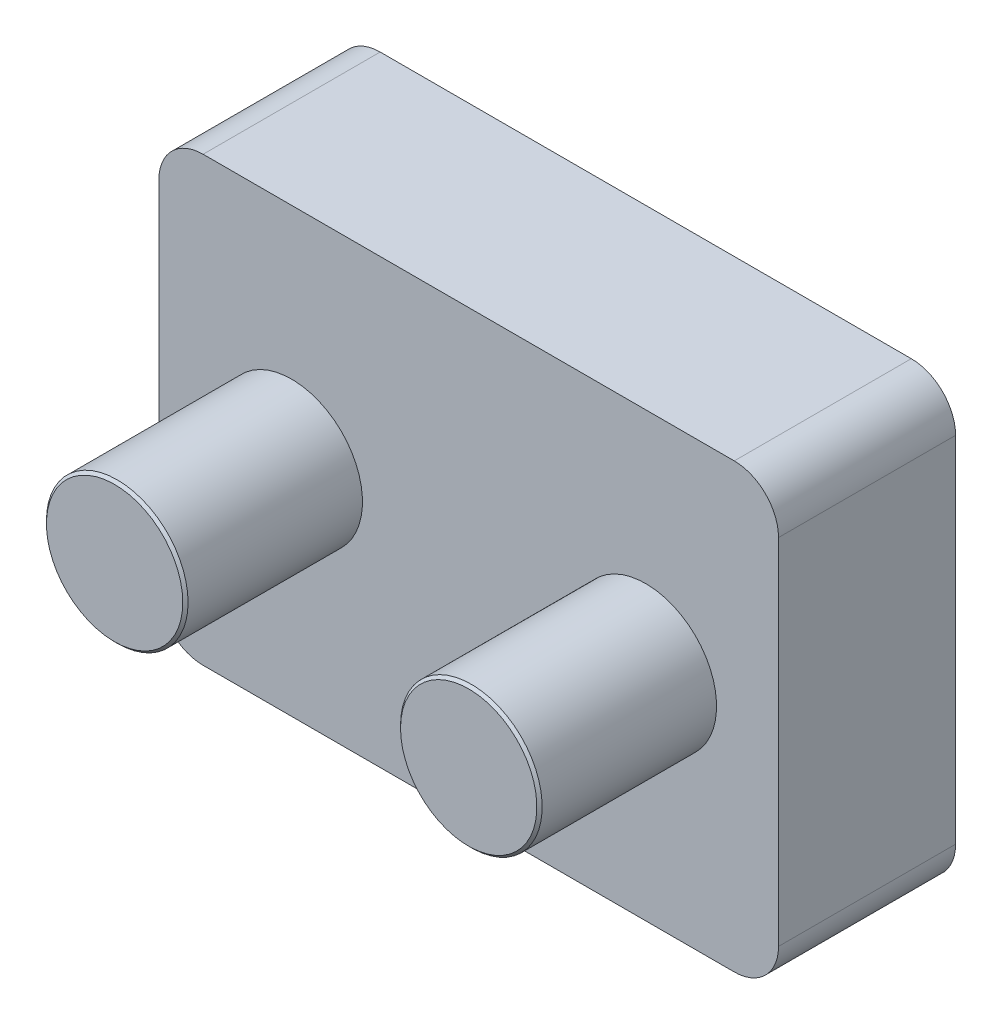
ISO-10303-21;
HEADER;
FILE_DESCRIPTION(('STEP AP214'),'2;1');
FILE_NAME('part.step','',(''),(''),'','','');
FILE_SCHEMA(('AUTOMOTIVE_DESIGN { 1 0 10303 214 1 1 1 1 }'));
ENDSEC;
DATA;
#1=APPLICATION_CONTEXT('core data for automotive mechanical design processes');
#2=APPLICATION_PROTOCOL_DEFINITION('international standard','automotive_design',2000,#1);
#3=PRODUCT_CONTEXT('',#1,'mechanical');
#4=PRODUCT('Part','Part','',(#3));
#5=PRODUCT_RELATED_PRODUCT_CATEGORY('part','',(#4));
#6=PRODUCT_DEFINITION_FORMATION('','',#4);
#7=PRODUCT_DEFINITION_CONTEXT('part definition',#1,'design');
#8=PRODUCT_DEFINITION('design','',#6,#7);
#9=PRODUCT_DEFINITION_SHAPE('','',#8);
#10=(LENGTH_UNIT() NAMED_UNIT(*) SI_UNIT(.MILLI.,.METRE.));
#11=(NAMED_UNIT(*) PLANE_ANGLE_UNIT() SI_UNIT($,.RADIAN.));
#12=(NAMED_UNIT(*) SI_UNIT($,.STERADIAN.) SOLID_ANGLE_UNIT());
#13=UNCERTAINTY_MEASURE_WITH_UNIT(LENGTH_MEASURE(1.E-05),#10,'distance_accuracy_value','');
#14=(GEOMETRIC_REPRESENTATION_CONTEXT(3) GLOBAL_UNCERTAINTY_ASSIGNED_CONTEXT((#13)) GLOBAL_UNIT_ASSIGNED_CONTEXT((#10,
#11,#12)) REPRESENTATION_CONTEXT('',''));
#15=CARTESIAN_POINT('',(0.,0.,0.));
#16=DIRECTION('',(0.,0.,1.));
#17=DIRECTION('',(1.,0.,0.));
#18=AXIS2_PLACEMENT_3D('',#15,#16,#17);
#19=CARTESIAN_POINT('',(-34.9999999999999,25.,20.0000000000001));
#20=DIRECTION('',(1.,0.,0.));
#21=DIRECTION('',(0.,1.,0.));
#22=AXIS2_PLACEMENT_3D('',#19,#20,#21);
#23=PLANE('',#22);
#24=DIRECTION('',(0.,-1.,0.));
#25=VECTOR('',#24,1.);
#26=CARTESIAN_POINT('',(-35.,25.,2.22044604925031E-13));
#27=LINE('',#26,#25);
#28=CARTESIAN_POINT('',(-35.,20.,2.22044604925031E-13));
#29=VERTEX_POINT('',#28);
#30=CARTESIAN_POINT('',(-35.,-20.,2.22044604925031E-13));
#31=VERTEX_POINT('',#30);
#32=EDGE_CURVE('E140',#29,#31,#27,.T.);
#33=ORIENTED_EDGE('',*,*,#32,.T.);
#34=DIRECTION('',(0.,0.,-1.));
#35=VECTOR('',#34,1.);
#36=CARTESIAN_POINT('',(-34.9999999999999,-20.,20.0000000000001));
#37=LINE('',#36,#35);
#38=CARTESIAN_POINT('',(-34.9999999999999,-20.,20.0000000000001));
#39=VERTEX_POINT('',#38);
#40=EDGE_CURVE('E118',#31,#39,#37,.F.);
#41=ORIENTED_EDGE('',*,*,#40,.T.);
#42=DIRECTION('',(0.,-1.,0.));
#43=VECTOR('',#42,1.);
#44=CARTESIAN_POINT('',(-34.9999999999999,25.,20.0000000000001));
#45=LINE('',#44,#43);
#46=CARTESIAN_POINT('',(-34.9999999999999,20.,20.0000000000001));
#47=VERTEX_POINT('',#46);
#48=EDGE_CURVE('E149',#47,#39,#45,.T.);
#49=ORIENTED_EDGE('',*,*,#48,.F.);
#50=DIRECTION('',(0.,0.,-1.));
#51=VECTOR('',#50,1.);
#52=CARTESIAN_POINT('',(-34.9999999999999,20.,20.0000000000001));
#53=LINE('',#52,#51);
#54=EDGE_CURVE('E123',#47,#29,#53,.T.);
#55=ORIENTED_EDGE('',*,*,#54,.T.);
#56=EDGE_LOOP('',(#33,#41,#49,#55));
#57=FACE_BOUND('',#56,.T.);
#58=ADVANCED_FACE('F47',(#57),#23,.F.);
#59=CARTESIAN_POINT('',(35.0000000000001,-25.,20.0000000000002));
#60=DIRECTION('',(0.,1.,0.));
#61=DIRECTION('',(-1.,0.,0.));
#62=AXIS2_PLACEMENT_3D('',#59,#60,#61);
#63=PLANE('',#62);
#64=DIRECTION('',(1.,0.,0.));
#65=VECTOR('',#64,1.);
#66=CARTESIAN_POINT('',(35.0000000000001,-25.,20.0000000000002));
#67=LINE('',#66,#65);
#68=CARTESIAN_POINT('',(-29.9999999999999,-25.,20.0000000000001));
#69=VERTEX_POINT('',#68);
#70=CARTESIAN_POINT('',(30.0000000000001,-25.,20.0000000000002));
#71=VERTEX_POINT('',#70);
#72=EDGE_CURVE('E133',#69,#71,#67,.T.);
#73=ORIENTED_EDGE('',*,*,#72,.F.);
#74=DIRECTION('',(0.,0.,-1.));
#75=VECTOR('',#74,1.);
#76=CARTESIAN_POINT('',(-29.9999999999999,-25.,20.0000000000001));
#77=LINE('',#76,#75);
#78=CARTESIAN_POINT('',(-30.,-25.,0.));
#79=VERTEX_POINT('',#78);
#80=EDGE_CURVE('E117',#69,#79,#77,.T.);
#81=ORIENTED_EDGE('',*,*,#80,.T.);
#82=DIRECTION('',(1.,0.,0.));
#83=VECTOR('',#82,1.);
#84=CARTESIAN_POINT('',(35.,-25.,0.));
#85=LINE('',#84,#83);
#86=CARTESIAN_POINT('',(30.,-25.,0.));
#87=VERTEX_POINT('',#86);
#88=EDGE_CURVE('E130',#79,#87,#85,.T.);
#89=ORIENTED_EDGE('',*,*,#88,.T.);
#90=DIRECTION('',(0.,0.,-1.));
#91=VECTOR('',#90,1.);
#92=CARTESIAN_POINT('',(30.0000000000001,-25.,20.0000000000002));
#93=LINE('',#92,#91);
#94=EDGE_CURVE('E135',#87,#71,#93,.F.);
#95=ORIENTED_EDGE('',*,*,#94,.T.);
#96=EDGE_LOOP('',(#73,#81,#89,#95));
#97=FACE_BOUND('',#96,.T.);
#98=ADVANCED_FACE('F129',(#97),#63,.F.);
#99=CARTESIAN_POINT('',(35.0000000000001,25.,20.0000000000002));
#100=DIRECTION('',(-1.,0.,0.));
#101=DIRECTION('',(0.,-1.,0.));
#102=AXIS2_PLACEMENT_3D('',#99,#100,#101);
#103=PLANE('',#102);
#104=DIRECTION('',(0.,1.,0.));
#105=VECTOR('',#104,1.);
#106=CARTESIAN_POINT('',(35.0000000000001,25.,20.0000000000002));
#107=LINE('',#106,#105);
#108=CARTESIAN_POINT('',(35.0000000000001,-20.,20.0000000000002));
#109=VERTEX_POINT('',#108);
#110=CARTESIAN_POINT('',(35.0000000000001,20.,20.0000000000002));
#111=VERTEX_POINT('',#110);
#112=EDGE_CURVE('E193',#109,#111,#107,.T.);
#113=ORIENTED_EDGE('',*,*,#112,.F.);
#114=DIRECTION('',(0.,0.,-1.));
#115=VECTOR('',#114,1.);
#116=CARTESIAN_POINT('',(35.0000000000001,-20.,20.0000000000002));
#117=LINE('',#116,#115);
#118=CARTESIAN_POINT('',(35.,-20.,0.));
#119=VERTEX_POINT('',#118);
#120=EDGE_CURVE('E186',#109,#119,#117,.T.);
#121=ORIENTED_EDGE('',*,*,#120,.T.);
#122=DIRECTION('',(0.,1.,0.));
#123=VECTOR('',#122,1.);
#124=CARTESIAN_POINT('',(35.,25.,0.));
#125=LINE('',#124,#123);
#126=CARTESIAN_POINT('',(35.,20.,0.));
#127=VERTEX_POINT('',#126);
#128=EDGE_CURVE('E139',#119,#127,#125,.T.);
#129=ORIENTED_EDGE('',*,*,#128,.T.);
#130=DIRECTION('',(0.,0.,-1.));
#131=VECTOR('',#130,1.);
#132=CARTESIAN_POINT('',(35.0000000000001,20.,20.0000000000002));
#133=LINE('',#132,#131);
#134=EDGE_CURVE('E184',#127,#111,#133,.F.);
#135=ORIENTED_EDGE('',*,*,#134,.T.);
#136=EDGE_LOOP('',(#113,#121,#129,#135));
#137=FACE_BOUND('',#136,.T.);
#138=ADVANCED_FACE('F191',(#137),#103,.F.);
#139=CARTESIAN_POINT('',(35.0000000000001,25.,20.0000000000002));
#140=DIRECTION('',(0.,-1.,0.));
#141=DIRECTION('',(1.,0.,0.));
#142=AXIS2_PLACEMENT_3D('',#139,#140,#141);
#143=PLANE('',#142);
#144=DIRECTION('',(-1.,0.,0.));
#145=VECTOR('',#144,1.);
#146=CARTESIAN_POINT('',(35.0000000000001,25.,20.0000000000002));
#147=LINE('',#146,#145);
#148=CARTESIAN_POINT('',(30.0000000000001,25.,20.0000000000002));
#149=VERTEX_POINT('',#148);
#150=CARTESIAN_POINT('',(-29.9999999999999,25.,20.0000000000001));
#151=VERTEX_POINT('',#150);
#152=EDGE_CURVE('E154',#149,#151,#147,.T.);
#153=ORIENTED_EDGE('',*,*,#152,.F.);
#154=DIRECTION('',(0.,0.,-1.));
#155=VECTOR('',#154,1.);
#156=CARTESIAN_POINT('',(30.0000000000001,25.,20.0000000000002));
#157=LINE('',#156,#155);
#158=CARTESIAN_POINT('',(30.,25.,0.));
#159=VERTEX_POINT('',#158);
#160=EDGE_CURVE('E13',#149,#159,#157,.T.);
#161=ORIENTED_EDGE('',*,*,#160,.T.);
#162=DIRECTION('',(-1.,0.,0.));
#163=VECTOR('',#162,1.);
#164=CARTESIAN_POINT('',(35.,25.,0.));
#165=LINE('',#164,#163);
#166=CARTESIAN_POINT('',(-30.,25.,0.));
#167=VERTEX_POINT('',#166);
#168=EDGE_CURVE('E143',#159,#167,#165,.T.);
#169=ORIENTED_EDGE('',*,*,#168,.T.);
#170=DIRECTION('',(0.,0.,-1.));
#171=VECTOR('',#170,1.);
#172=CARTESIAN_POINT('',(-29.9999999999999,25.,20.0000000000001));
#173=LINE('',#172,#171);
#174=EDGE_CURVE('E55',#167,#151,#173,.F.);
#175=ORIENTED_EDGE('',*,*,#174,.T.);
#176=EDGE_LOOP('',(#153,#161,#169,#175));
#177=FACE_BOUND('',#176,.T.);
#178=ADVANCED_FACE('F200',(#177),#143,.F.);
#179=CARTESIAN_POINT('',(1.11022302462516E-13,0.,20.0000000000002));
#180=DIRECTION('',(0.,0.,-1.));
#181=DIRECTION('',(-1.,0.,0.));
#182=AXIS2_PLACEMENT_3D('',#179,#180,#181);
#183=PLANE('',#182);
#184=CARTESIAN_POINT('',(20.0000000000001,0.,20.0000000000002));
#185=DIRECTION('',(0.,0.,-1.));
#186=DIRECTION('',(-1.,0.,0.));
#187=AXIS2_PLACEMENT_3D('',#184,#185,#186);
#188=CIRCLE('',#187,7.99999999999999);
#189=CARTESIAN_POINT('',(12.0000000000001,0.,20.0000000000002));
#190=VERTEX_POINT('',#189);
#191=EDGE_CURVE('E153',#190,#190,#188,.F.);
#192=ORIENTED_EDGE('',*,*,#191,.F.);
#193=EDGE_LOOP('',(#192));
#194=FACE_BOUND('',#193,.T.);
#195=CARTESIAN_POINT('',(-19.9999999999999,0.,20.0000000000001));
#196=DIRECTION('',(0.,0.,-1.));
#197=DIRECTION('',(-1.,0.,0.));
#198=AXIS2_PLACEMENT_3D('',#195,#196,#197);
#199=CIRCLE('',#198,8.);
#200=CARTESIAN_POINT('',(-27.9999999999999,0.,20.0000000000001));
#201=VERTEX_POINT('',#200);
#202=EDGE_CURVE('E150',#201,#201,#199,.F.);
#203=ORIENTED_EDGE('',*,*,#202,.F.);
#204=EDGE_LOOP('',(#203));
#205=FACE_BOUND('',#204,.T.);
#206=ORIENTED_EDGE('',*,*,#48,.T.);
#207=CARTESIAN_POINT('',(-29.9999999999999,-20.,20.0000000000001));
#208=DIRECTION('',(0.,0.,-1.));
#209=DIRECTION('',(-1.,0.,0.));
#210=AXIS2_PLACEMENT_3D('',#207,#208,#209);
#211=CIRCLE('',#210,5.);
#212=EDGE_CURVE('E182',#39,#69,#211,.F.);
#213=ORIENTED_EDGE('',*,*,#212,.T.);
#214=ORIENTED_EDGE('',*,*,#72,.T.);
#215=CARTESIAN_POINT('',(30.0000000000001,-20.,20.0000000000002));
#216=DIRECTION('',(0.,0.,-1.));
#217=DIRECTION('',(-1.,0.,0.));
#218=AXIS2_PLACEMENT_3D('',#215,#216,#217);
#219=CIRCLE('',#218,5.);
#220=EDGE_CURVE('E180',#71,#109,#219,.F.);
#221=ORIENTED_EDGE('',*,*,#220,.T.);
#222=ORIENTED_EDGE('',*,*,#112,.T.);
#223=CARTESIAN_POINT('',(30.0000000000001,20.,20.0000000000002));
#224=DIRECTION('',(0.,0.,-1.));
#225=DIRECTION('',(-1.,0.,0.));
#226=AXIS2_PLACEMENT_3D('',#223,#224,#225);
#227=CIRCLE('',#226,5.);
#228=EDGE_CURVE('E68',#111,#149,#227,.F.);
#229=ORIENTED_EDGE('',*,*,#228,.T.);
#230=ORIENTED_EDGE('',*,*,#152,.T.);
#231=CARTESIAN_POINT('',(-29.9999999999999,20.,20.0000000000001));
#232=DIRECTION('',(0.,0.,-1.));
#233=DIRECTION('',(-1.,0.,0.));
#234=AXIS2_PLACEMENT_3D('',#231,#232,#233);
#235=CIRCLE('',#234,5.);
#236=EDGE_CURVE('E177',#151,#47,#235,.F.);
#237=ORIENTED_EDGE('',*,*,#236,.T.);
#238=EDGE_LOOP('',(#206,#213,#214,#221,#222,#229,#230,#237));
#239=FACE_BOUND('',#238,.T.);
#240=ADVANCED_FACE('F207',(#194,#205,#239),#183,.F.);
#241=CARTESIAN_POINT('',(0.,0.,0.));
#242=DIRECTION('',(0.,0.,-1.));
#243=DIRECTION('',(-1.,0.,0.));
#244=AXIS2_PLACEMENT_3D('',#241,#242,#243);
#245=PLANE('',#244);
#246=ORIENTED_EDGE('',*,*,#88,.F.);
#247=CARTESIAN_POINT('',(-30.,-20.,0.));
#248=DIRECTION('',(0.,0.,-1.));
#249=DIRECTION('',(-1.,0.,0.));
#250=AXIS2_PLACEMENT_3D('',#247,#248,#249);
#251=CIRCLE('',#250,5.);
#252=EDGE_CURVE('E113',#79,#31,#251,.T.);
#253=ORIENTED_EDGE('',*,*,#252,.T.);
#254=ORIENTED_EDGE('',*,*,#32,.F.);
#255=CARTESIAN_POINT('',(-30.,20.,0.));
#256=DIRECTION('',(0.,0.,-1.));
#257=DIRECTION('',(-1.,0.,0.));
#258=AXIS2_PLACEMENT_3D('',#255,#256,#257);
#259=CIRCLE('',#258,5.);
#260=EDGE_CURVE('E134',#29,#167,#259,.T.);
#261=ORIENTED_EDGE('',*,*,#260,.T.);
#262=ORIENTED_EDGE('',*,*,#168,.F.);
#263=CARTESIAN_POINT('',(30.,20.,0.));
#264=DIRECTION('',(0.,0.,-1.));
#265=DIRECTION('',(-1.,0.,0.));
#266=AXIS2_PLACEMENT_3D('',#263,#264,#265);
#267=CIRCLE('',#266,5.);
#268=EDGE_CURVE('E171',#159,#127,#267,.T.);
#269=ORIENTED_EDGE('',*,*,#268,.T.);
#270=ORIENTED_EDGE('',*,*,#128,.F.);
#271=CARTESIAN_POINT('',(30.,-20.,0.));
#272=DIRECTION('',(0.,0.,-1.));
#273=DIRECTION('',(-1.,0.,0.));
#274=AXIS2_PLACEMENT_3D('',#271,#272,#273);
#275=CIRCLE('',#274,5.);
#276=EDGE_CURVE('E124',#119,#87,#275,.T.);
#277=ORIENTED_EDGE('',*,*,#276,.T.);
#278=EDGE_LOOP('',(#246,#253,#254,#261,#262,#269,#270,#277));
#279=FACE_BOUND('',#278,.T.);
#280=ADVANCED_FACE('F137',(#279),#245,.T.);
#281=CARTESIAN_POINT('',(-19.9999999999999,0.,40.0000000000001));
#282=DIRECTION('',(0.,0.,-1.));
#283=DIRECTION('',(-1.,0.,0.));
#284=AXIS2_PLACEMENT_3D('',#281,#282,#283);
#285=CYLINDRICAL_SURFACE('',#284,8.);
#286=CARTESIAN_POINT('',(-19.9999999999999,0.,39.7000000000001));
#287=DIRECTION('',(0.,0.,1.));
#288=DIRECTION('',(1.,0.,0.));
#289=AXIS2_PLACEMENT_3D('',#286,#287,#288);
#290=CIRCLE('',#289,8.);
#291=CARTESIAN_POINT('',(-11.9999999999999,0.,39.7000000000001));
#292=VERTEX_POINT('',#291);
#293=EDGE_CURVE('E166',#292,#292,#290,.F.);
#294=ORIENTED_EDGE('',*,*,#293,.T.);
#295=EDGE_LOOP('',(#294));
#296=FACE_BOUND('',#295,.T.);
#297=ORIENTED_EDGE('',*,*,#202,.T.);
#298=EDGE_LOOP('',(#297));
#299=FACE_BOUND('',#298,.T.);
#300=ADVANCED_FACE('F278',(#296,#299),#285,.T.);
#301=CARTESIAN_POINT('',(-19.9999999999999,0.,40.0000000000001));
#302=DIRECTION('',(0.,0.,1.));
#303=DIRECTION('',(1.,0.,0.));
#304=AXIS2_PLACEMENT_3D('',#301,#302,#303);
#305=PLANE('',#304);
#306=CARTESIAN_POINT('',(-19.9999999999999,0.,40.0000000000001));
#307=DIRECTION('',(0.,0.,1.));
#308=DIRECTION('',(1.,0.,0.));
#309=AXIS2_PLACEMENT_3D('',#306,#307,#308);
#310=CIRCLE('',#309,7.70000000000001);
#311=CARTESIAN_POINT('',(-12.2999999999999,0.,40.0000000000001));
#312=VERTEX_POINT('',#311);
#313=EDGE_CURVE('E163',#312,#312,#310,.T.);
#314=ORIENTED_EDGE('',*,*,#313,.T.);
#315=EDGE_LOOP('',(#314));
#316=FACE_BOUND('',#315,.T.);
#317=ADVANCED_FACE('F270',(#316),#305,.T.);
#318=CARTESIAN_POINT('',(20.0000000000001,0.,40.0000000000002));
#319=DIRECTION('',(0.,0.,-1.));
#320=DIRECTION('',(-1.,0.,0.));
#321=AXIS2_PLACEMENT_3D('',#318,#319,#320);
#322=CYLINDRICAL_SURFACE('',#321,7.99999999999999);
#323=CARTESIAN_POINT('',(20.0000000000001,0.,39.7000000000002));
#324=DIRECTION('',(0.,0.,-1.));
#325=DIRECTION('',(-1.,0.,0.));
#326=AXIS2_PLACEMENT_3D('',#323,#324,#325);
#327=CIRCLE('',#326,7.99999999999999);
#328=CARTESIAN_POINT('',(12.0000000000001,0.,39.7000000000002));
#329=VERTEX_POINT('',#328);
#330=EDGE_CURVE('E160',#329,#329,#327,.T.);
#331=ORIENTED_EDGE('',*,*,#330,.T.);
#332=EDGE_LOOP('',(#331));
#333=FACE_BOUND('',#332,.T.);
#334=ORIENTED_EDGE('',*,*,#191,.T.);
#335=EDGE_LOOP('',(#334));
#336=FACE_BOUND('',#335,.T.);
#337=ADVANCED_FACE('F262',(#333,#336),#322,.T.);
#338=CARTESIAN_POINT('',(20.0000000000001,0.,40.0000000000002));
#339=DIRECTION('',(0.,0.,-1.));
#340=DIRECTION('',(-1.,0.,0.));
#341=AXIS2_PLACEMENT_3D('',#338,#339,#340);
#342=PLANE('',#341);
#343=CARTESIAN_POINT('',(20.0000000000001,0.,40.0000000000002));
#344=DIRECTION('',(0.,0.,-1.));
#345=DIRECTION('',(-1.,0.,0.));
#346=AXIS2_PLACEMENT_3D('',#343,#344,#345);
#347=CIRCLE('',#346,7.7);
#348=CARTESIAN_POINT('',(12.3000000000001,0.,40.0000000000002));
#349=VERTEX_POINT('',#348);
#350=EDGE_CURVE('E157',#349,#349,#347,.F.);
#351=ORIENTED_EDGE('',*,*,#350,.T.);
#352=EDGE_LOOP('',(#351));
#353=FACE_BOUND('',#352,.T.);
#354=ADVANCED_FACE('F228',(#353),#342,.F.);
#355=CARTESIAN_POINT('',(20.0000000000001,0.,40.0000000000002));
#356=DIRECTION('',(0.,0.,-1.));
#357=DIRECTION('',(-1.,0.,0.));
#358=AXIS2_PLACEMENT_3D('',#355,#356,#357);
#359=CONICAL_SURFACE('',#358,7.7,0.785398163397425);
#360=ORIENTED_EDGE('',*,*,#330,.F.);
#361=EDGE_LOOP('',(#360));
#362=FACE_BOUND('',#361,.T.);
#363=ORIENTED_EDGE('',*,*,#350,.F.);
#364=EDGE_LOOP('',(#363));
#365=FACE_BOUND('',#364,.T.);
#366=ADVANCED_FACE('F224',(#362,#365),#359,.T.);
#367=CARTESIAN_POINT('',(-19.9999999999999,0.,40.0000000000001));
#368=DIRECTION('',(0.,0.,-1.));
#369=DIRECTION('',(-1.,0.,0.));
#370=AXIS2_PLACEMENT_3D('',#367,#368,#369);
#371=CONICAL_SURFACE('',#370,7.70000000000001,0.785398163397445);
#372=ORIENTED_EDGE('',*,*,#293,.F.);
#373=EDGE_LOOP('',(#372));
#374=FACE_BOUND('',#373,.T.);
#375=ORIENTED_EDGE('',*,*,#313,.F.);
#376=EDGE_LOOP('',(#375));
#377=FACE_BOUND('',#376,.T.);
#378=ADVANCED_FACE('F227',(#374,#377),#371,.T.);
#379=CARTESIAN_POINT('',(-29.9999999999999,-20.,20.0000000000001));
#380=DIRECTION('',(0.,0.,-1.));
#381=DIRECTION('',(-1.,0.,0.));
#382=AXIS2_PLACEMENT_3D('',#379,#380,#381);
#383=CYLINDRICAL_SURFACE('',#382,5.);
#384=ORIENTED_EDGE('',*,*,#212,.F.);
#385=ORIENTED_EDGE('',*,*,#40,.F.);
#386=ORIENTED_EDGE('',*,*,#252,.F.);
#387=ORIENTED_EDGE('',*,*,#80,.F.);
#388=EDGE_LOOP('',(#384,#385,#386,#387));
#389=FACE_BOUND('',#388,.T.);
#390=ADVANCED_FACE('F116',(#389),#383,.T.);
#391=CARTESIAN_POINT('',(30.0000000000001,-20.,20.0000000000002));
#392=DIRECTION('',(0.,0.,-1.));
#393=DIRECTION('',(-1.,0.,0.));
#394=AXIS2_PLACEMENT_3D('',#391,#392,#393);
#395=CYLINDRICAL_SURFACE('',#394,5.);
#396=ORIENTED_EDGE('',*,*,#220,.F.);
#397=ORIENTED_EDGE('',*,*,#94,.F.);
#398=ORIENTED_EDGE('',*,*,#276,.F.);
#399=ORIENTED_EDGE('',*,*,#120,.F.);
#400=EDGE_LOOP('',(#396,#397,#398,#399));
#401=FACE_BOUND('',#400,.T.);
#402=ADVANCED_FACE('F215',(#401),#395,.T.);
#403=CARTESIAN_POINT('',(30.0000000000001,20.,20.0000000000002));
#404=DIRECTION('',(0.,0.,-1.));
#405=DIRECTION('',(-1.,0.,0.));
#406=AXIS2_PLACEMENT_3D('',#403,#404,#405);
#407=CYLINDRICAL_SURFACE('',#406,5.);
#408=ORIENTED_EDGE('',*,*,#228,.F.);
#409=ORIENTED_EDGE('',*,*,#134,.F.);
#410=ORIENTED_EDGE('',*,*,#268,.F.);
#411=ORIENTED_EDGE('',*,*,#160,.F.);
#412=EDGE_LOOP('',(#408,#409,#410,#411));
#413=FACE_BOUND('',#412,.T.);
#414=ADVANCED_FACE('F199',(#413),#407,.T.);
#415=CARTESIAN_POINT('',(-29.9999999999999,20.,20.0000000000001));
#416=DIRECTION('',(0.,0.,-1.));
#417=DIRECTION('',(-1.,0.,0.));
#418=AXIS2_PLACEMENT_3D('',#415,#416,#417);
#419=CYLINDRICAL_SURFACE('',#418,5.);
#420=ORIENTED_EDGE('',*,*,#236,.F.);
#421=ORIENTED_EDGE('',*,*,#174,.F.);
#422=ORIENTED_EDGE('',*,*,#260,.F.);
#423=ORIENTED_EDGE('',*,*,#54,.F.);
#424=EDGE_LOOP('',(#420,#421,#422,#423));
#425=FACE_BOUND('',#424,.T.);
#426=ADVANCED_FACE('F49',(#425),#419,.T.);
#427=CLOSED_SHELL('',(#58,#98,#138,#178,#240,#280,#300,#317,#337,#354,#366,#378,#390,#402,#414,#426));
#428=MANIFOLD_SOLID_BREP('B2',#427);
#429=ADVANCED_BREP_SHAPE_REPRESENTATION('',(#18,#428),#14);
#430=SHAPE_DEFINITION_REPRESENTATION(#9,#429);
ENDSEC;
END-ISO-10303-21;
